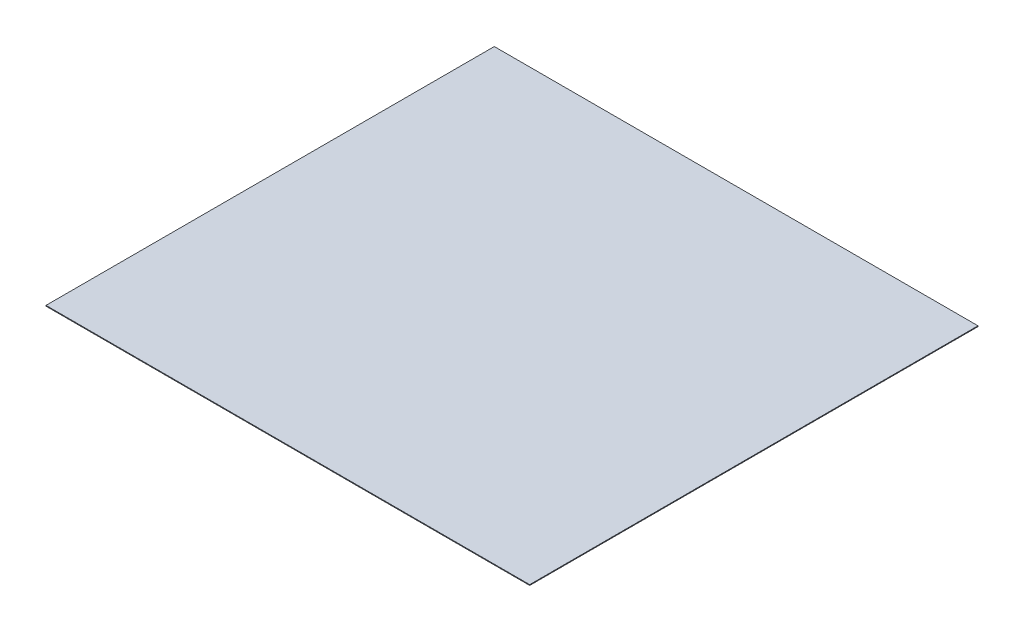
ISO-10303-21;
HEADER;
FILE_DESCRIPTION(('STEP AP214'),'2;1');
FILE_NAME('part.step','',(''),(''),'','','');
FILE_SCHEMA(('AUTOMOTIVE_DESIGN { 1 0 10303 214 1 1 1 1 }'));
ENDSEC;
DATA;
#1=APPLICATION_CONTEXT('core data for automotive mechanical design processes');
#2=APPLICATION_PROTOCOL_DEFINITION('international standard','automotive_design',2000,#1);
#3=PRODUCT_CONTEXT('',#1,'mechanical');
#4=PRODUCT('Part','Part','',(#3));
#5=PRODUCT_RELATED_PRODUCT_CATEGORY('part','',(#4));
#6=PRODUCT_DEFINITION_FORMATION('','',#4);
#7=PRODUCT_DEFINITION_CONTEXT('part definition',#1,'design');
#8=PRODUCT_DEFINITION('design','',#6,#7);
#9=PRODUCT_DEFINITION_SHAPE('','',#8);
#10=(LENGTH_UNIT() NAMED_UNIT(*) SI_UNIT(.MILLI.,.METRE.));
#11=(NAMED_UNIT(*) PLANE_ANGLE_UNIT() SI_UNIT($,.RADIAN.));
#12=(NAMED_UNIT(*) SI_UNIT($,.STERADIAN.) SOLID_ANGLE_UNIT());
#13=UNCERTAINTY_MEASURE_WITH_UNIT(LENGTH_MEASURE(1.E-05),#10,'distance_accuracy_value','');
#14=(GEOMETRIC_REPRESENTATION_CONTEXT(3) GLOBAL_UNCERTAINTY_ASSIGNED_CONTEXT((#13)) GLOBAL_UNIT_ASSIGNED_CONTEXT((#10,
#11,#12)) REPRESENTATION_CONTEXT('',''));
#15=CARTESIAN_POINT('',(0.,0.,0.));
#16=DIRECTION('',(0.,0.,1.));
#17=DIRECTION('',(1.,0.,0.));
#18=AXIS2_PLACEMENT_3D('',#15,#16,#17);
#19=CARTESIAN_POINT('',(-1282.18281779829,3.175,917.245300666462));
#20=DIRECTION('',(1.,0.,0.));
#21=DIRECTION('',(0.,0.,-1.));
#22=AXIS2_PLACEMENT_3D('',#19,#20,#21);
#23=PLANE('',#22);
#24=DIRECTION('',(0.,0.,1.));
#25=VECTOR('',#24,1.);
#26=CARTESIAN_POINT('',(-1282.18281779829,0.,917.245300666462));
#27=LINE('',#26,#25);
#28=CARTESIAN_POINT('',(-1282.18281779829,0.,-1013.15469933354));
#29=VERTEX_POINT('',#28);
#30=CARTESIAN_POINT('',(-1282.18281779829,0.,917.245300666462));
#31=VERTEX_POINT('',#30);
#32=EDGE_CURVE('E107',#29,#31,#27,.T.);
#33=ORIENTED_EDGE('',*,*,#32,.T.);
#34=DIRECTION('',(0.,-1.,0.));
#35=VECTOR('',#34,1.);
#36=CARTESIAN_POINT('',(-1282.18281779829,3.175,917.245300666462));
#37=LINE('',#36,#35);
#38=CARTESIAN_POINT('',(-1282.18281779829,3.175,917.245300666462));
#39=VERTEX_POINT('',#38);
#40=EDGE_CURVE('E11',#39,#31,#37,.T.);
#41=ORIENTED_EDGE('',*,*,#40,.F.);
#42=DIRECTION('',(0.,0.,1.));
#43=VECTOR('',#42,1.);
#44=CARTESIAN_POINT('',(-1282.18281779829,3.175,917.245300666462));
#45=LINE('',#44,#43);
#46=CARTESIAN_POINT('',(-1282.18281779829,3.175,-1013.15469933354));
#47=VERTEX_POINT('',#46);
#48=EDGE_CURVE('E91',#47,#39,#45,.T.);
#49=ORIENTED_EDGE('',*,*,#48,.F.);
#50=DIRECTION('',(0.,-1.,0.));
#51=VECTOR('',#50,1.);
#52=CARTESIAN_POINT('',(-1282.18281779829,3.175,-1013.15469933354));
#53=LINE('',#52,#51);
#54=EDGE_CURVE('E103',#47,#29,#53,.T.);
#55=ORIENTED_EDGE('',*,*,#54,.T.);
#56=EDGE_LOOP('',(#33,#41,#49,#55));
#57=FACE_BOUND('',#56,.T.);
#58=ADVANCED_FACE('F39',(#57),#23,.F.);
#59=CARTESIAN_POINT('',(-1282.18281779829,3.175,917.245300666462));
#60=DIRECTION('',(0.,0.,-1.));
#61=DIRECTION('',(-1.,0.,0.));
#62=AXIS2_PLACEMENT_3D('',#59,#60,#61);
#63=PLANE('',#62);
#64=DIRECTION('',(1.,0.,0.));
#65=VECTOR('',#64,1.);
#66=CARTESIAN_POINT('',(-1282.18281779829,0.,917.245300666462));
#67=LINE('',#66,#65);
#68=CARTESIAN_POINT('',(800.617182201706,0.,917.245300666462));
#69=VERTEX_POINT('',#68);
#70=EDGE_CURVE('E96',#31,#69,#67,.T.);
#71=ORIENTED_EDGE('',*,*,#70,.T.);
#72=DIRECTION('',(0.,-1.,0.));
#73=VECTOR('',#72,1.);
#74=CARTESIAN_POINT('',(800.617182201706,3.175,917.245300666462));
#75=LINE('',#74,#73);
#76=CARTESIAN_POINT('',(800.617182201706,3.175,917.245300666462));
#77=VERTEX_POINT('',#76);
#78=EDGE_CURVE('E48',#77,#69,#75,.T.);
#79=ORIENTED_EDGE('',*,*,#78,.F.);
#80=DIRECTION('',(1.,0.,0.));
#81=VECTOR('',#80,1.);
#82=CARTESIAN_POINT('',(-1282.18281779829,3.175,917.245300666462));
#83=LINE('',#82,#81);
#84=EDGE_CURVE('E86',#39,#77,#83,.T.);
#85=ORIENTED_EDGE('',*,*,#84,.F.);
#86=ORIENTED_EDGE('',*,*,#40,.T.);
#87=EDGE_LOOP('',(#71,#79,#85,#86));
#88=FACE_BOUND('',#87,.T.);
#89=ADVANCED_FACE('F95',(#88),#63,.F.);
#90=CARTESIAN_POINT('',(800.617182201706,3.175,917.245300666462));
#91=DIRECTION('',(-1.,0.,0.));
#92=DIRECTION('',(0.,0.,1.));
#93=AXIS2_PLACEMENT_3D('',#90,#91,#92);
#94=PLANE('',#93);
#95=DIRECTION('',(0.,0.,-1.));
#96=VECTOR('',#95,1.);
#97=CARTESIAN_POINT('',(800.617182201706,0.,917.245300666462));
#98=LINE('',#97,#96);
#99=CARTESIAN_POINT('',(800.617182201706,0.,-1013.15469933354));
#100=VERTEX_POINT('',#99);
#101=EDGE_CURVE('E73',#69,#100,#98,.T.);
#102=ORIENTED_EDGE('',*,*,#101,.T.);
#103=DIRECTION('',(0.,-1.,0.));
#104=VECTOR('',#103,1.);
#105=CARTESIAN_POINT('',(800.617182201706,3.175,-1013.15469933354));
#106=LINE('',#105,#104);
#107=CARTESIAN_POINT('',(800.617182201706,3.175,-1013.15469933354));
#108=VERTEX_POINT('',#107);
#109=EDGE_CURVE('E98',#108,#100,#106,.T.);
#110=ORIENTED_EDGE('',*,*,#109,.F.);
#111=DIRECTION('',(0.,0.,-1.));
#112=VECTOR('',#111,1.);
#113=CARTESIAN_POINT('',(800.617182201706,3.175,917.245300666462));
#114=LINE('',#113,#112);
#115=EDGE_CURVE('E89',#77,#108,#114,.T.);
#116=ORIENTED_EDGE('',*,*,#115,.F.);
#117=ORIENTED_EDGE('',*,*,#78,.T.);
#118=EDGE_LOOP('',(#102,#110,#116,#117));
#119=FACE_BOUND('',#118,.T.);
#120=ADVANCED_FACE('F99',(#119),#94,.F.);
#121=CARTESIAN_POINT('',(-1282.18281779829,3.175,-1013.15469933354));
#122=DIRECTION('',(0.,0.,1.));
#123=DIRECTION('',(1.,0.,0.));
#124=AXIS2_PLACEMENT_3D('',#121,#122,#123);
#125=PLANE('',#124);
#126=DIRECTION('',(-1.,0.,0.));
#127=VECTOR('',#126,1.);
#128=CARTESIAN_POINT('',(-1282.18281779829,0.,-1013.15469933354));
#129=LINE('',#128,#127);
#130=EDGE_CURVE('E79',#100,#29,#129,.T.);
#131=ORIENTED_EDGE('',*,*,#130,.T.);
#132=ORIENTED_EDGE('',*,*,#54,.F.);
#133=DIRECTION('',(-1.,0.,0.));
#134=VECTOR('',#133,1.);
#135=CARTESIAN_POINT('',(-1282.18281779829,3.175,-1013.15469933354));
#136=LINE('',#135,#134);
#137=EDGE_CURVE('E56',#108,#47,#136,.T.);
#138=ORIENTED_EDGE('',*,*,#137,.F.);
#139=ORIENTED_EDGE('',*,*,#109,.T.);
#140=EDGE_LOOP('',(#131,#132,#138,#139));
#141=FACE_BOUND('',#140,.T.);
#142=ADVANCED_FACE('F120',(#141),#125,.F.);
#143=CARTESIAN_POINT('',(0.,3.175,0.));
#144=DIRECTION('',(0.,-1.,0.));
#145=DIRECTION('',(0.,0.,-1.));
#146=AXIS2_PLACEMENT_3D('',#143,#144,#145);
#147=PLANE('',#146);
#148=ORIENTED_EDGE('',*,*,#48,.T.);
#149=ORIENTED_EDGE('',*,*,#84,.T.);
#150=ORIENTED_EDGE('',*,*,#115,.T.);
#151=ORIENTED_EDGE('',*,*,#137,.T.);
#152=EDGE_LOOP('',(#148,#149,#150,#151));
#153=FACE_BOUND('',#152,.T.);
#154=ADVANCED_FACE('F87',(#153),#147,.F.);
#155=CARTESIAN_POINT('',(0.,0.,0.));
#156=DIRECTION('',(0.,-1.,0.));
#157=DIRECTION('',(0.,0.,-1.));
#158=AXIS2_PLACEMENT_3D('',#155,#156,#157);
#159=PLANE('',#158);
#160=ORIENTED_EDGE('',*,*,#32,.F.);
#161=ORIENTED_EDGE('',*,*,#130,.F.);
#162=ORIENTED_EDGE('',*,*,#101,.F.);
#163=ORIENTED_EDGE('',*,*,#70,.F.);
#164=EDGE_LOOP('',(#160,#161,#162,#163));
#165=FACE_BOUND('',#164,.T.);
#166=ADVANCED_FACE('F123',(#165),#159,.T.);
#167=CLOSED_SHELL('',(#58,#89,#120,#142,#154,#166));
#168=MANIFOLD_SOLID_BREP('B2',#167);
#169=ADVANCED_BREP_SHAPE_REPRESENTATION('',(#18,#168),#14);
#170=SHAPE_DEFINITION_REPRESENTATION(#9,#169);
ENDSEC;
END-ISO-10303-21;
